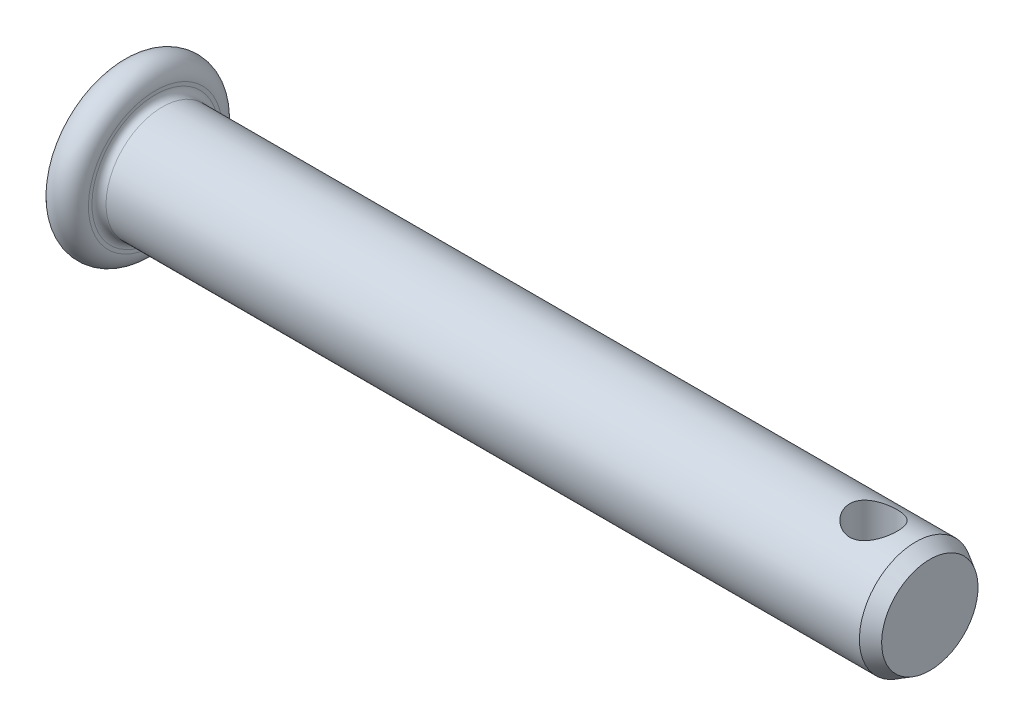
ISO-10303-21;
HEADER;
FILE_DESCRIPTION(('STEP AP214'),'2;1');
FILE_NAME('part.step','',(''),(''),'','','');
FILE_SCHEMA(('AUTOMOTIVE_DESIGN { 1 0 10303 214 1 1 1 1 }'));
ENDSEC;
DATA;
#1=APPLICATION_CONTEXT('core data for automotive mechanical design processes');
#2=APPLICATION_PROTOCOL_DEFINITION('international standard','automotive_design',2000,#1);
#3=PRODUCT_CONTEXT('',#1,'mechanical');
#4=PRODUCT('Part','Part','',(#3));
#5=PRODUCT_RELATED_PRODUCT_CATEGORY('part','',(#4));
#6=PRODUCT_DEFINITION_FORMATION('','',#4);
#7=PRODUCT_DEFINITION_CONTEXT('part definition',#1,'design');
#8=PRODUCT_DEFINITION('design','',#6,#7);
#9=PRODUCT_DEFINITION_SHAPE('','',#8);
#10=(LENGTH_UNIT() NAMED_UNIT(*) SI_UNIT(.MILLI.,.METRE.));
#11=(NAMED_UNIT(*) PLANE_ANGLE_UNIT() SI_UNIT($,.RADIAN.));
#12=(NAMED_UNIT(*) SI_UNIT($,.STERADIAN.) SOLID_ANGLE_UNIT());
#13=UNCERTAINTY_MEASURE_WITH_UNIT(LENGTH_MEASURE(1.E-05),#10,'distance_accuracy_value','');
#14=(GEOMETRIC_REPRESENTATION_CONTEXT(3) GLOBAL_UNCERTAINTY_ASSIGNED_CONTEXT((#13)) GLOBAL_UNIT_ASSIGNED_CONTEXT((#10,
#11,#12)) REPRESENTATION_CONTEXT('',''));
#15=CARTESIAN_POINT('',(0.,0.,0.));
#16=DIRECTION('',(0.,0.,1.));
#17=DIRECTION('',(1.,0.,0.));
#18=AXIS2_PLACEMENT_3D('',#15,#16,#17);
#19=CARTESIAN_POINT('',(57.5,0.,0.));
#20=DIRECTION('',(-1.,0.,0.));
#21=DIRECTION('',(0.,-1.,0.));
#22=AXIS2_PLACEMENT_3D('',#19,#20,#21);
#23=PLANE('',#22);
#24=CARTESIAN_POINT('',(57.5,0.,0.));
#25=DIRECTION('',(-1.,0.,0.));
#26=DIRECTION('',(0.,-1.,0.));
#27=AXIS2_PLACEMENT_3D('',#24,#25,#26);
#28=CIRCLE('',#27,3.42264973081038);
#29=CARTESIAN_POINT('',(57.5,-3.42264973081038,0.));
#30=VERTEX_POINT('',#29);
#31=EDGE_CURVE('E111',#30,#30,#28,.T.);
#32=ORIENTED_EDGE('',*,*,#31,.F.);
#33=EDGE_LOOP('',(#32));
#34=FACE_BOUND('',#33,.T.);
#35=ADVANCED_FACE('F37',(#34),#23,.F.);
#36=CARTESIAN_POINT('',(0.,0.,0.));
#37=DIRECTION('',(1.,0.,0.));
#38=DIRECTION('',(0.,1.,0.));
#39=AXIS2_PLACEMENT_3D('',#36,#37,#38);
#40=PLANE('',#39);
#41=CARTESIAN_POINT('',(0.,0.,0.));
#42=DIRECTION('',(-1.,0.,0.));
#43=DIRECTION('',(0.,-1.,0.));
#44=AXIS2_PLACEMENT_3D('',#41,#42,#43);
#45=CIRCLE('',#44,4.75);
#46=CARTESIAN_POINT('',(0.,-4.75,0.));
#47=VERTEX_POINT('',#46);
#48=EDGE_CURVE('E55',#47,#47,#45,.T.);
#49=ORIENTED_EDGE('',*,*,#48,.T.);
#50=EDGE_LOOP('',(#49));
#51=FACE_BOUND('',#50,.T.);
#52=ADVANCED_FACE('F87',(#51),#40,.F.);
#53=CARTESIAN_POINT('',(1.25,0.,0.));
#54=DIRECTION('',(-1.,0.,0.));
#55=DIRECTION('',(0.,-1.,0.));
#56=AXIS2_PLACEMENT_3D('',#53,#54,#55);
#57=TOROIDAL_SURFACE('',#56,4.75,1.25);
#58=ORIENTED_EDGE('',*,*,#48,.F.);
#59=EDGE_LOOP('',(#58));
#60=FACE_BOUND('',#59,.T.);
#61=CARTESIAN_POINT('',(2.5,0.,0.));
#62=DIRECTION('',(-1.,0.,0.));
#63=DIRECTION('',(0.,-1.,0.));
#64=AXIS2_PLACEMENT_3D('',#61,#62,#63);
#65=CIRCLE('',#64,4.75);
#66=CARTESIAN_POINT('',(2.5,-4.75,0.));
#67=VERTEX_POINT('',#66);
#68=EDGE_CURVE('E105',#67,#67,#65,.T.);
#69=ORIENTED_EDGE('',*,*,#68,.T.);
#70=EDGE_LOOP('',(#69));
#71=FACE_BOUND('',#70,.T.);
#72=ADVANCED_FACE('F92',(#60,#71),#57,.T.);
#73=CARTESIAN_POINT('',(2.5,4.,0.));
#74=DIRECTION('',(-1.,0.,0.));
#75=DIRECTION('',(0.,-1.,0.));
#76=AXIS2_PLACEMENT_3D('',#73,#74,#75);
#77=PLANE('',#76);
#78=CARTESIAN_POINT('',(2.5,0.,0.));
#79=DIRECTION('',(-1.,0.,0.));
#80=DIRECTION('',(0.,-1.,0.));
#81=AXIS2_PLACEMENT_3D('',#78,#79,#80);
#82=CIRCLE('',#81,4.5);
#83=CARTESIAN_POINT('',(2.5,-4.50000000000001,0.));
#84=VERTEX_POINT('',#83);
#85=EDGE_CURVE('E50',#84,#84,#82,.T.);
#86=ORIENTED_EDGE('',*,*,#85,.T.);
#87=EDGE_LOOP('',(#86));
#88=FACE_BOUND('',#87,.T.);
#89=ORIENTED_EDGE('',*,*,#68,.F.);
#90=EDGE_LOOP('',(#89));
#91=FACE_BOUND('',#90,.T.);
#92=ADVANCED_FACE('F82',(#88,#91),#77,.F.);
#93=CARTESIAN_POINT('',(-19.830028721469,0.,0.));
#94=DIRECTION('',(-1.,0.,0.));
#95=DIRECTION('',(0.,-1.,0.));
#96=AXIS2_PLACEMENT_3D('',#93,#94,#95);
#97=CYLINDRICAL_SURFACE('',#96,4.);
#98=CARTESIAN_POINT('',(55.19,-4.00000000000001,0.));
#99=CARTESIAN_POINT('',(55.1899899011063,-3.99999236748302,-0.0904187977378593));
#100=CARTESIAN_POINT('',(55.1827007252309,-3.99689882603684,-0.180974137610629));
#101=CARTESIAN_POINT('',(55.1538054531713,-3.98482238752453,-0.359513324239304));
#102=CARTESIAN_POINT('',(55.1321625811007,-3.97582436309427,-0.44748995786481));
#103=CARTESIAN_POINT('',(55.0755068437876,-3.95290460936051,-0.617994430443012));
#104=CARTESIAN_POINT('',(55.0405397888905,-3.93899976235193,-0.700539814947887));
#105=CARTESIAN_POINT('',(54.9584200452412,-3.90761479968937,-0.858511149356958));
#106=CARTESIAN_POINT('',(54.9112708570087,-3.89013571138924,-0.933939135949756));
#107=CARTESIAN_POINT('',(54.8035713675209,-3.85234213214195,-1.07952774502228));
#108=CARTESIAN_POINT('',(54.7424961927455,-3.83193309851281,-1.14927531816146));
#109=CARTESIAN_POINT('',(54.6097890191149,-3.79098272951728,-1.27789469821148));
#110=CARTESIAN_POINT('',(54.5381513531126,-3.77044132882458,-1.33676062828834));
#111=CARTESIAN_POINT('',(54.381933511229,-3.73037948410024,-1.44491079202455));
#112=CARTESIAN_POINT('',(54.2968800429519,-3.71096429077668,-1.49355448088582));
#113=CARTESIAN_POINT('',(54.1188602140836,-3.67685815218387,-1.57566032710225));
#114=CARTESIAN_POINT('',(54.0258980740859,-3.66216470683065,-1.60913052242906));
#115=CARTESIAN_POINT('',(53.8394547045164,-3.64019193551199,-1.65822137924007));
#116=CARTESIAN_POINT('',(53.7462233843253,-3.63258380882293,-1.67463822731531));
#117=CARTESIAN_POINT('',(53.5580428898949,-3.62470066552943,-1.6916389519161));
#118=CARTESIAN_POINT('',(53.4630947331715,-3.62442143921493,-1.69223191766067));
#119=CARTESIAN_POINT('',(53.2822115720055,-3.63095018056392,-1.67816648000947));
#120=CARTESIAN_POINT('',(53.1961585634535,-3.63719828804049,-1.66471292395005));
#121=CARTESIAN_POINT('',(53.0276704625412,-3.65512928265603,-1.62496162231373));
#122=CARTESIAN_POINT('',(52.9452360898247,-3.6668132455216,-1.59866133438612));
#123=CARTESIAN_POINT('',(52.7842134633098,-3.69456536442449,-1.53344740790442));
#124=CARTESIAN_POINT('',(52.7057464225774,-3.71072259813572,-1.4942740934633));
#125=CARTESIAN_POINT('',(52.5561886939706,-3.74558141462285,-1.40461025505431));
#126=CARTESIAN_POINT('',(52.4851009769583,-3.76428401519589,-1.35411519868849));
#127=CARTESIAN_POINT('',(52.3458006531251,-3.80410788012476,-1.23807868093097));
#128=CARTESIAN_POINT('',(52.2783781919277,-3.825297901223,-1.17160958067256));
#129=CARTESIAN_POINT('',(52.1553677286279,-3.86633781546775,-1.02810403715588));
#130=CARTESIAN_POINT('',(52.0997826558681,-3.88618737606884,-0.95106498593922));
#131=CARTESIAN_POINT('',(52.0008212269935,-3.92291605594622,-0.786147490487131));
#132=CARTESIAN_POINT('',(51.9577749533755,-3.93971111726981,-0.698050860019768));
#133=CARTESIAN_POINT('',(51.8873926493535,-3.96778959195378,-0.514975339328133));
#134=CARTESIAN_POINT('',(51.8600476850783,-3.97907613904825,-0.420000397501672));
#135=CARTESIAN_POINT('',(51.8235180996916,-3.99427537725438,-0.232459958250162));
#136=CARTESIAN_POINT('',(51.8132736260463,-3.99861764618435,-0.140135702281219));
#137=CARTESIAN_POINT('',(51.8080652975695,-4.0008167507452,0.0450077112308816));
#138=CARTESIAN_POINT('',(51.8130968971114,-3.99867551564121,0.137826713349782));
#139=CARTESIAN_POINT('',(51.8375469045198,-3.98842570699486,0.316304079999674));
#140=CARTESIAN_POINT('',(51.8562134516761,-3.98062913203958,0.40208542297463));
#141=CARTESIAN_POINT('',(51.9063486482162,-3.9601897273826,0.569200242421755));
#142=CARTESIAN_POINT('',(51.9378189034848,-3.94754628978231,0.650533159504978));
#143=CARTESIAN_POINT('',(52.0136937529498,-3.91813067285639,0.809306683760334));
#144=CARTESIAN_POINT('',(52.0584708597801,-3.90124210751332,0.886547008511276));
#145=CARTESIAN_POINT('',(52.1592800742839,-3.86512833606226,1.03269506611375));
#146=CARTESIAN_POINT('',(52.2153169359489,-3.84590214434147,1.10159925960638));
#147=CARTESIAN_POINT('',(52.3418618208302,-3.80543486846858,1.23443718760682));
#148=CARTESIAN_POINT('',(52.4131300154153,-3.78414945926641,1.29763513044853));
#149=CARTESIAN_POINT('',(52.5655852552031,-3.74321342333031,1.41138831787398));
#150=CARTESIAN_POINT('',(52.6467747862854,-3.72356320839066,1.46194038421239));
#151=CARTESIAN_POINT('',(52.8186171738411,-3.68795624343166,1.54960079926506));
#152=CARTESIAN_POINT('',(52.909400729139,-3.67206366347157,1.58648095327108));
#153=CARTESIAN_POINT('',(53.0967741063234,-3.6466307825754,1.64410901959406));
#154=CARTESIAN_POINT('',(53.1933588812829,-3.63708504486726,1.66487074169268));
#155=CARTESIAN_POINT('',(53.3814050370259,-3.62627283049224,1.68828207541125));
#156=CARTESIAN_POINT('',(53.4726715889582,-3.62441401780232,1.69222825892826));
#157=CARTESIAN_POINT('',(53.6545169764997,-3.6276047997137,1.68537785637329));
#158=CARTESIAN_POINT('',(53.7450959226141,-3.63265325955355,1.67458369192035));
#159=CARTESIAN_POINT('',(53.9183943718921,-3.64854188176089,1.63965823769036));
#160=CARTESIAN_POINT('',(54.0012812947408,-3.65908483673161,1.61620934370254));
#161=CARTESIAN_POINT('',(54.1619579299726,-3.68453317416481,1.55731779637359));
#162=CARTESIAN_POINT('',(54.2397461943733,-3.69943978936205,1.52187175339319));
#163=CARTESIAN_POINT('',(54.3932046246751,-3.73306367433837,1.43750296026299));
#164=CARTESIAN_POINT('',(54.4684555149398,-3.75195803310329,1.38788953597359));
#165=CARTESIAN_POINT('',(54.6099691655344,-3.79094917474782,1.27754679821321));
#166=CARTESIAN_POINT('',(54.67622865482,-3.81104639141229,1.21681345812639));
#167=CARTESIAN_POINT('',(54.8030484595676,-3.852007517481,1.08049597704433));
#168=CARTESIAN_POINT('',(54.8627965148831,-3.87281413459316,1.00413525518048));
#169=CARTESIAN_POINT('',(54.9686810504932,-3.91132777067814,0.841707314434265));
#170=CARTESIAN_POINT('',(55.0148113500708,-3.92903338071274,0.755635712477176));
#171=CARTESIAN_POINT('',(55.0911906645604,-3.9591126790373,0.577463560917091));
#172=CARTESIAN_POINT('',(55.1216765157013,-3.97156534053617,0.485478199081785));
#173=CARTESIAN_POINT('',(55.1664534639197,-3.99005502570015,0.297210456084861));
#174=CARTESIAN_POINT('',(55.1807950092869,-3.99611203103567,0.200942443236259));
#175=CARTESIAN_POINT('',(55.1889309821243,-3.99954937588166,0.0695327137178543));
#176=CARTESIAN_POINT('',(55.1900038841894,-4.00000293558308,0.0347764561266228));
#177=CARTESIAN_POINT('',(55.19,-4.00000000000001,0.));
#178=B_SPLINE_CURVE_WITH_KNOTS('',3,(#98,#99,#100,#101,#102,#103,#104,#105,#106,#107,#108,#109,
#110,#111,#112,#113,#114,#115,#116,#117,#118,#119,#120,#121,#122,#123,#124,#125,#126,#127,#128,
#129,#130,#131,#132,#133,#134,#135,#136,#137,#138,#139,#140,#141,#142,#143,#144,#145,#146,#147,
#148,#149,#150,#151,#152,#153,#154,#155,#156,#157,#158,#159,#160,#161,#162,#163,#164,#165,#166,
#167,#168,#169,#170,#171,#172,#173,#174,#175,#176,#177),.UNSPECIFIED.,.T.,.F.,(4,2,2,2,2,2,2,2,
2,2,2,2,2,2,2,2,2,2,2,2,2,2,2,2,2,2,2,2,2,2,2,2,2,2,2,2,2,2,2,4),(0.,0.271155352410765,
0.543008135123755,0.813934563447639,1.08478322783958,1.36833684086816,1.65204314773266,
1.95019604386879,2.24819081208449,2.53154452617534,2.81473547872731,3.07548540746319,
3.33628695917326,3.602710422346,3.86924073303781,4.15899322089025,4.44881732931355,
4.74569559637372,5.04240477516915,5.31993012353291,5.5973728981285,5.86057213852875,
6.12380440045921,6.39523980822149,6.66679006069919,6.95826732215517,7.24981776617141,
7.54603599625318,7.84200015463492,8.11467710807924,8.38730927016072,8.64652640689927,
8.90581684330844,9.18093787353906,9.45615872516715,9.75223361784433,10.0484426847202,
10.3400244401021,10.6306924992217,10.7349830057594),.UNSPECIFIED.);
#179=CARTESIAN_POINT('',(55.19,-4.00000000000001,0.));
#180=VERTEX_POINT('',#179);
#181=EDGE_CURVE('E41',#180,#180,#178,.T.);
#182=ORIENTED_EDGE('',*,*,#181,.T.);
#183=EDGE_LOOP('',(#182));
#184=FACE_BOUND('',#183,.T.);
#185=CARTESIAN_POINT('',(53.5,3.62545169599596,1.69));
#186=CARTESIAN_POINT('',(53.4099896565998,3.62546192302852,1.68998954402772));
#187=CARTESIAN_POINT('',(53.3198377126378,3.62885279422355,1.68276342481874));
#188=CARTESIAN_POINT('',(53.1421433925003,3.64198374908706,1.65414170794563));
#189=CARTESIAN_POINT('',(53.0546086689034,3.6517408476845,1.63270813576492));
#190=CARTESIAN_POINT('',(52.8850437625381,3.67628322992874,1.57666301675589));
#191=CARTESIAN_POINT('',(52.802992354043,3.69104759672391,1.54210621878332));
#192=CARTESIAN_POINT('',(52.6458745195389,3.72391120243561,1.46095655462127));
#193=CARTESIAN_POINT('',(52.5708065830727,3.74200971767253,1.41436629942292));
#194=CARTESIAN_POINT('',(52.4249364035265,3.78079759662957,1.30728387964333));
#195=CARTESIAN_POINT('',(52.3546349786747,3.80157637937352,1.24614155833801));
#196=CARTESIAN_POINT('',(52.2249122825175,3.84264964134149,1.11305502989553));
#197=CARTESIAN_POINT('',(52.1654952756833,3.86294392804523,1.04110660897816));
#198=CARTESIAN_POINT('',(52.056648094851,3.90185369318746,0.884491861966546));
#199=CARTESIAN_POINT('',(52.0077848671923,3.92035316471671,0.799400060817033));
#200=CARTESIAN_POINT('',(51.9252841922069,3.95249037506626,0.621280978752292));
#201=CARTESIAN_POINT('',(51.8916398052341,3.96613032917626,0.528257337725481));
#202=CARTESIAN_POINT('',(51.8423576797172,3.98637688010699,0.342176689313932));
#203=CARTESIAN_POINT('',(51.8258553794203,3.99331975514909,0.249385997667376));
#204=CARTESIAN_POINT('',(51.8085287776509,4.00061356995853,0.0621103990187187));
#205=CARTESIAN_POINT('',(51.8076979268764,4.00096726342951,-0.0323737837263959));
#206=CARTESIAN_POINT('',(51.8212923437805,3.99523843612913,-0.214054636913356));
#207=CARTESIAN_POINT('',(51.8347667067471,3.98955706830709,-0.301337505980618));
#208=CARTESIAN_POINT('',(51.8749544417347,3.97295101153571,-0.472267741944365));
#209=CARTESIAN_POINT('',(51.9016687910144,3.96202593554408,-0.555914839984575));
#210=CARTESIAN_POINT('',(51.9678908411894,3.93577482015856,-0.718740012492846));
#211=CARTESIAN_POINT('',(52.0075878908574,3.92038404963874,-0.797830209724033));
#212=CARTESIAN_POINT('',(52.0984597401621,3.88669993325261,-0.948434286504439));
#213=CARTESIAN_POINT('',(52.1496386312784,3.86840555338548,-1.01994545190675));
#214=CARTESIAN_POINT('',(52.2663147358883,3.82918385285631,-1.15884843523314));
#215=CARTESIAN_POINT('',(52.3325788630539,3.80816179944303,-1.22557023060839));
#216=CARTESIAN_POINT('',(52.4753898100783,3.76683663920766,-1.34724897512098));
#217=CARTESIAN_POINT('',(52.5519408036593,3.74653382845342,-1.4022011253262));
#218=CARTESIAN_POINT('',(52.7164903995023,3.70825818935342,-1.50056991743592));
#219=CARTESIAN_POINT('',(52.8047934322316,3.69039027621424,-1.54352167667046));
#220=CARTESIAN_POINT('',(52.9883341210015,3.66026555039342,-1.61366994264465));
#221=CARTESIAN_POINT('',(53.0835665972888,3.64800459545783,-1.6408780842565));
#222=CARTESIAN_POINT('',(53.2715418756484,3.63151761283099,-1.67703658533111));
#223=CARTESIAN_POINT('',(53.3640325190954,3.62681364391136,-1.68707582778294));
#224=CARTESIAN_POINT('',(53.549476625762,3.62460557298366,-1.69181738410996));
#225=CARTESIAN_POINT('',(53.6424299089935,3.62709886079828,-1.6865252580997));
#226=CARTESIAN_POINT('',(53.8196285378539,3.63850945757684,-1.66174871282359));
#227=CARTESIAN_POINT('',(53.9040413711456,3.64698757160528,-1.64323362650653));
#228=CARTESIAN_POINT('',(54.0684877583068,3.66884545760737,-1.59383095336659));
#229=CARTESIAN_POINT('',(54.1485202640446,3.68222639689421,-1.56294041991099));
#230=CARTESIAN_POINT('',(54.3057762870349,3.713080703667,-1.48819627789288));
#231=CARTESIAN_POINT('',(54.3827318080239,3.73070507015414,-1.44384319363482));
#232=CARTESIAN_POINT('',(54.528484434633,3.76785129208199,-1.34392517543229));
#233=CARTESIAN_POINT('',(54.5972779184165,3.78737398294872,-1.28835529345226));
#234=CARTESIAN_POINT('',(54.730781593711,3.82809934570634,-1.16207188787365));
#235=CARTESIAN_POINT('',(54.7946609364973,3.84930513346377,-1.09047749340152));
#236=CARTESIAN_POINT('',(54.9096554148167,3.88948850167692,-0.937100636248119));
#237=CARTESIAN_POINT('',(54.9607694521715,3.90846589035276,-0.855317297935168));
#238=CARTESIAN_POINT('',(55.0487801159765,3.94220214177945,-0.683192200859044));
#239=CARTESIAN_POINT('',(55.0856238100712,3.95694524722351,-0.592820098229113));
#240=CARTESIAN_POINT('',(55.1433091632284,3.98040998980534,-0.406375513726348));
#241=CARTESIAN_POINT('',(55.1641606445279,3.98913532265893,-0.310306569917818));
#242=CARTESIAN_POINT('',(55.188007499786,3.99914547124397,-0.122610587658173));
#243=CARTESIAN_POINT('',(55.1921733169586,4.00091781506117,-0.0311572874269446));
#244=CARTESIAN_POINT('',(55.1856972501891,3.99818273243728,0.151117418705645));
#245=CARTESIAN_POINT('',(55.1750580934397,3.99367646256614,0.241938937889094));
#246=CARTESIAN_POINT('',(55.1401144480559,3.97915040050802,0.41687966554955));
#247=CARTESIAN_POINT('',(55.1163336060424,3.96934217928078,0.501122515217066));
#248=CARTESIAN_POINT('',(55.0563613108114,3.94530203487433,0.664384656023049));
#249=CARTESIAN_POINT('',(55.0201675350918,3.93106928389726,0.743402966329959));
#250=CARTESIAN_POINT('',(54.9345635474537,3.89874762537577,0.897931791202404));
#251=CARTESIAN_POINT('',(54.8846275794776,3.88051289884084,0.973119826224286));
#252=CARTESIAN_POINT('',(54.7737130233507,3.84233468242001,1.11437274723461));
#253=CARTESIAN_POINT('',(54.7127301995593,3.82239053865155,1.18043411664614));
#254=CARTESIAN_POINT('',(54.5764039033153,3.78127410103613,1.30639208356124));
#255=CARTESIAN_POINT('',(54.5003523312393,3.76011401455836,1.36552900693854));
#256=CARTESIAN_POINT('',(54.3387618103011,3.72039003763807,1.47032345235983));
#257=CARTESIAN_POINT('',(54.2532174979195,3.70182762844577,1.51597330014093));
#258=CARTESIAN_POINT('',(54.0750954704008,3.66974039965027,1.59207830250915));
#259=CARTESIAN_POINT('',(53.9825450080796,3.65619715793751,1.62258916514176));
#260=CARTESIAN_POINT('',(53.7930357843021,3.63606758123937,1.66722462754603));
#261=CARTESIAN_POINT('',(53.6960929567905,3.62945791860339,1.68140418897049));
#262=CARTESIAN_POINT('',(53.5658539611967,3.6258968676752,1.68904150048392));
#263=CARTESIAN_POINT('',(53.5329364605036,3.62544795373434,1.69000382603494));
#264=CARTESIAN_POINT('',(53.5,3.62545169599596,1.69));
#265=B_SPLINE_CURVE_WITH_KNOTS('',3,(#185,#186,#187,#188,#189,#190,#191,#192,#193,#194,#195,
#196,#197,#198,#199,#200,#201,#202,#203,#204,#205,#206,#207,#208,#209,#210,#211,#212,#213,#214,
#215,#216,#217,#218,#219,#220,#221,#222,#223,#224,#225,#226,#227,#228,#229,#230,#231,#232,#233,
#234,#235,#236,#237,#238,#239,#240,#241,#242,#243,#244,#245,#246,#247,#248,#249,#250,#251,#252,
#253,#254,#255,#256,#257,#258,#259,#260,#261,#262,#263,#264),.UNSPECIFIED.,.T.,.F.,(4,2,2,2,2,2,
2,2,2,2,2,2,2,2,2,2,2,2,2,2,2,2,2,2,2,2,2,2,2,2,2,2,2,2,2,2,2,2,2,4),(0.,0.269934554719433,
0.540593531495699,0.810135533229384,1.07961909943576,1.36475097350601,1.64999432327795,
1.9480218642779,2.24591337023152,2.52791925563513,2.80980728451053,3.07406535273625,
3.3383429290623,3.60666095242299,3.87507474146735,4.16286483591935,4.45077205089104,
4.74864024670216,5.04628802943071,5.32424257954195,5.60209633854324,5.86143286407071,
6.1208311751715,6.39136298201112,6.66201438964838,6.95544280186153,7.24889644855262,
7.54342839750494,7.83777930306402,8.11107759765953,8.38432555521863,8.6473978516005,
8.91051939657834,9.18559543189627,9.46077716235039,9.75530077463545,10.0499916520672,
10.3435899392072,10.636197231359,10.734971310695),.UNSPECIFIED.);
#266=CARTESIAN_POINT('',(53.5,3.62545169599596,1.69));
#267=VERTEX_POINT('',#266);
#268=EDGE_CURVE('E58',#267,#267,#265,.T.);
#269=ORIENTED_EDGE('',*,*,#268,.T.);
#270=EDGE_LOOP('',(#269));
#271=FACE_BOUND('',#270,.T.);
#272=CARTESIAN_POINT('',(3.,0.,0.));
#273=DIRECTION('',(-1.,0.,0.));
#274=DIRECTION('',(0.,-1.,0.));
#275=AXIS2_PLACEMENT_3D('',#272,#273,#274);
#276=CIRCLE('',#275,4.);
#277=CARTESIAN_POINT('',(3.,-4.00000000000001,0.));
#278=VERTEX_POINT('',#277);
#279=EDGE_CURVE('E10',#278,#278,#276,.F.);
#280=ORIENTED_EDGE('',*,*,#279,.T.);
#281=EDGE_LOOP('',(#280));
#282=FACE_BOUND('',#281,.T.);
#283=CARTESIAN_POINT('',(56.5,0.,0.));
#284=DIRECTION('',(-1.,0.,0.));
#285=DIRECTION('',(0.,-1.,0.));
#286=AXIS2_PLACEMENT_3D('',#283,#284,#285);
#287=CIRCLE('',#286,4.00000000000001);
#288=CARTESIAN_POINT('',(56.5,-4.00000000000001,0.));
#289=VERTEX_POINT('',#288);
#290=EDGE_CURVE('E107',#289,#289,#287,.T.);
#291=ORIENTED_EDGE('',*,*,#290,.T.);
#292=EDGE_LOOP('',(#291));
#293=FACE_BOUND('',#292,.T.);
#294=ADVANCED_FACE('F63',(#184,#271,#282,#293),#97,.T.);
#295=CARTESIAN_POINT('',(57.5,0.,0.));
#296=DIRECTION('',(-1.,0.,0.));
#297=DIRECTION('',(0.,-1.,0.));
#298=AXIS2_PLACEMENT_3D('',#295,#296,#297);
#299=CONICAL_SURFACE('',#298,3.42264973081038,0.523598775598297);
#300=ORIENTED_EDGE('',*,*,#290,.F.);
#301=EDGE_LOOP('',(#300));
#302=FACE_BOUND('',#301,.T.);
#303=ORIENTED_EDGE('',*,*,#31,.T.);
#304=EDGE_LOOP('',(#303));
#305=FACE_BOUND('',#304,.T.);
#306=ADVANCED_FACE('F71',(#302,#305),#299,.T.);
#307=CARTESIAN_POINT('',(3.,0.,0.));
#308=DIRECTION('',(-1.,0.,0.));
#309=DIRECTION('',(0.,-1.,0.));
#310=AXIS2_PLACEMENT_3D('',#307,#308,#309);
#311=TOROIDAL_SURFACE('',#310,4.5,0.5);
#312=ORIENTED_EDGE('',*,*,#279,.F.);
#313=EDGE_LOOP('',(#312));
#314=FACE_BOUND('',#313,.T.);
#315=ORIENTED_EDGE('',*,*,#85,.F.);
#316=EDGE_LOOP('',(#315));
#317=FACE_BOUND('',#316,.T.);
#318=ADVANCED_FACE('F39',(#314,#317),#311,.F.);
#319=CARTESIAN_POINT('',(53.5,-6.,0.));
#320=DIRECTION('',(0.,1.,0.));
#321=DIRECTION('',(0.,0.,1.));
#322=AXIS2_PLACEMENT_3D('',#319,#320,#321);
#323=CYLINDRICAL_SURFACE('',#322,1.69);
#324=ORIENTED_EDGE('',*,*,#268,.F.);
#325=EDGE_LOOP('',(#324));
#326=FACE_BOUND('',#325,.T.);
#327=ORIENTED_EDGE('',*,*,#181,.F.);
#328=EDGE_LOOP('',(#327));
#329=FACE_BOUND('',#328,.T.);
#330=ADVANCED_FACE('F67',(#326,#329),#323,.F.);
#331=CLOSED_SHELL('',(#35,#52,#72,#92,#294,#306,#318,#330));
#332=MANIFOLD_SOLID_BREP('B2',#331);
#333=ADVANCED_BREP_SHAPE_REPRESENTATION('',(#18,#332),#14);
#334=SHAPE_DEFINITION_REPRESENTATION(#9,#333);
ENDSEC;
END-ISO-10303-21;
